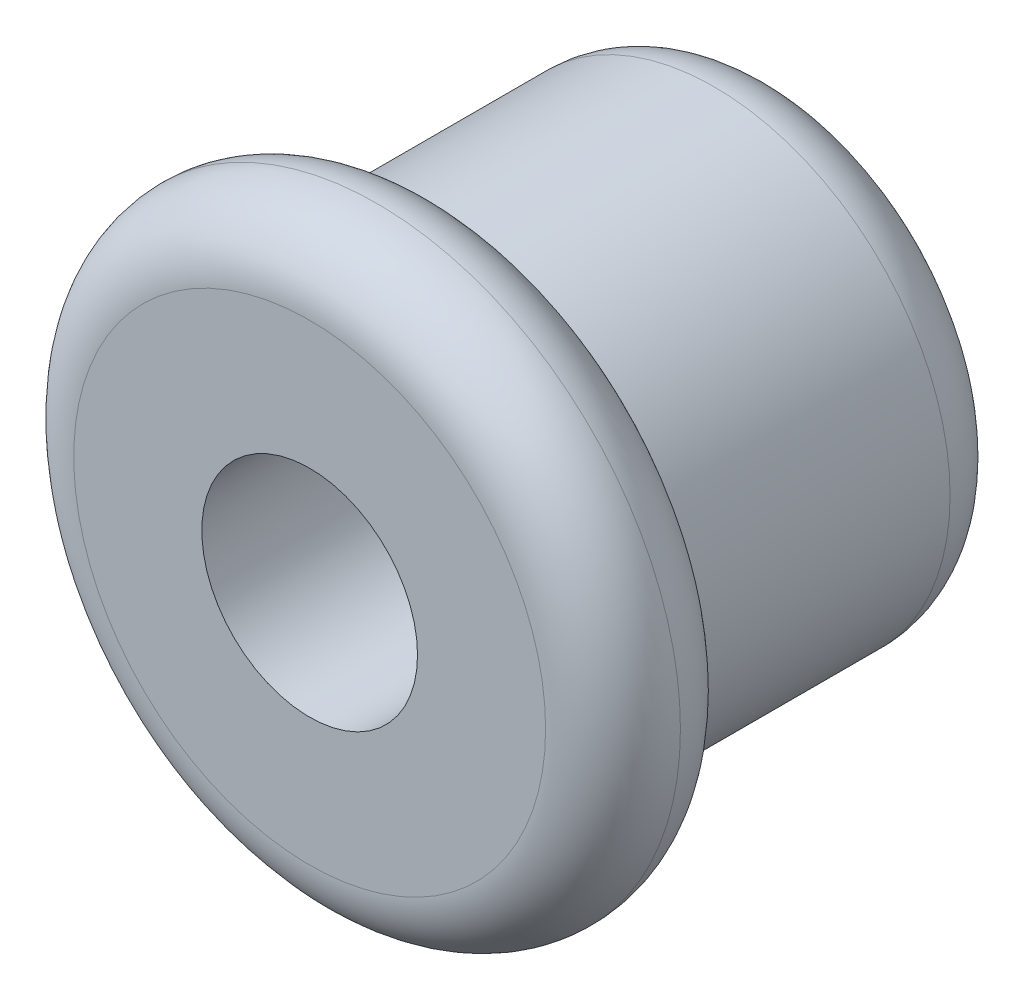
ISO-10303-21;
HEADER;
FILE_DESCRIPTION(('STEP AP214'),'2;1');
FILE_NAME('part.step','',(''),(''),'','','');
FILE_SCHEMA(('AUTOMOTIVE_DESIGN { 1 0 10303 214 1 1 1 1 }'));
ENDSEC;
DATA;
#1=APPLICATION_CONTEXT('core data for automotive mechanical design processes');
#2=APPLICATION_PROTOCOL_DEFINITION('international standard','automotive_design',2000,#1);
#3=PRODUCT_CONTEXT('',#1,'mechanical');
#4=PRODUCT('Part','Part','',(#3));
#5=PRODUCT_RELATED_PRODUCT_CATEGORY('part','',(#4));
#6=PRODUCT_DEFINITION_FORMATION('','',#4);
#7=PRODUCT_DEFINITION_CONTEXT('part definition',#1,'design');
#8=PRODUCT_DEFINITION('design','',#6,#7);
#9=PRODUCT_DEFINITION_SHAPE('','',#8);
#10=(LENGTH_UNIT() NAMED_UNIT(*) SI_UNIT(.MILLI.,.METRE.));
#11=(NAMED_UNIT(*) PLANE_ANGLE_UNIT() SI_UNIT($,.RADIAN.));
#12=(NAMED_UNIT(*) SI_UNIT($,.STERADIAN.) SOLID_ANGLE_UNIT());
#13=UNCERTAINTY_MEASURE_WITH_UNIT(LENGTH_MEASURE(1.E-05),#10,'distance_accuracy_value','');
#14=(GEOMETRIC_REPRESENTATION_CONTEXT(3) GLOBAL_UNCERTAINTY_ASSIGNED_CONTEXT((#13)) GLOBAL_UNIT_ASSIGNED_CONTEXT((#10,
#11,#12)) REPRESENTATION_CONTEXT('',''));
#15=CARTESIAN_POINT('',(0.,0.,0.));
#16=DIRECTION('',(0.,0.,1.));
#17=DIRECTION('',(1.,0.,0.));
#18=AXIS2_PLACEMENT_3D('',#15,#16,#17);
#19=CARTESIAN_POINT('',(0.,0.,2.5));
#20=DIRECTION('',(0.,0.,-1.));
#21=DIRECTION('',(-1.,0.,0.));
#22=AXIS2_PLACEMENT_3D('',#19,#20,#21);
#23=CYLINDRICAL_SURFACE('',#22,1.75);
#24=CARTESIAN_POINT('',(0.,0.,0.5));
#25=DIRECTION('',(0.,0.,1.));
#26=DIRECTION('',(1.,0.,0.));
#27=AXIS2_PLACEMENT_3D('',#24,#25,#26);
#28=CIRCLE('',#27,1.75);
#29=CARTESIAN_POINT('',(1.75,0.,0.5));
#30=VERTEX_POINT('',#29);
#31=EDGE_CURVE('E44',#30,#30,#28,.T.);
#32=ORIENTED_EDGE('',*,*,#31,.T.);
#33=EDGE_LOOP('',(#32));
#34=FACE_BOUND('',#33,.T.);
#35=CARTESIAN_POINT('',(0.,0.,2.5));
#36=DIRECTION('',(0.,0.,1.));
#37=DIRECTION('',(1.,0.,0.));
#38=AXIS2_PLACEMENT_3D('',#35,#36,#37);
#39=CIRCLE('',#38,1.75);
#40=CARTESIAN_POINT('',(1.75,0.,2.5));
#41=VERTEX_POINT('',#40);
#42=EDGE_CURVE('E49',#41,#41,#39,.T.);
#43=ORIENTED_EDGE('',*,*,#42,.F.);
#44=EDGE_LOOP('',(#43));
#45=FACE_BOUND('',#44,.T.);
#46=ADVANCED_FACE('F32',(#34,#45),#23,.T.);
#47=CARTESIAN_POINT('',(0.,0.,0.));
#48=DIRECTION('',(0.,0.,1.));
#49=DIRECTION('',(1.,0.,0.));
#50=AXIS2_PLACEMENT_3D('',#47,#48,#49);
#51=PLANE('',#50);
#52=CARTESIAN_POINT('',(0.,0.,0.));
#53=DIRECTION('',(0.,0.,1.));
#54=DIRECTION('',(1.,0.,0.));
#55=AXIS2_PLACEMENT_3D('',#52,#53,#54);
#56=CIRCLE('',#55,1.25);
#57=CARTESIAN_POINT('',(1.25,0.,0.));
#58=VERTEX_POINT('',#57);
#59=EDGE_CURVE('E40',#58,#58,#56,.F.);
#60=ORIENTED_EDGE('',*,*,#59,.T.);
#61=EDGE_LOOP('',(#60));
#62=FACE_BOUND('',#61,.T.);
#63=CARTESIAN_POINT('',(0.,0.,0.));
#64=DIRECTION('',(0.,0.,1.));
#65=DIRECTION('',(1.,0.,0.));
#66=AXIS2_PLACEMENT_3D('',#63,#64,#65);
#67=CIRCLE('',#66,0.8);
#68=CARTESIAN_POINT('',(0.8,0.,0.));
#69=VERTEX_POINT('',#68);
#70=EDGE_CURVE('E53',#69,#69,#67,.T.);
#71=ORIENTED_EDGE('',*,*,#70,.T.);
#72=EDGE_LOOP('',(#71));
#73=FACE_BOUND('',#72,.T.);
#74=ADVANCED_FACE('F76',(#62,#73),#51,.F.);
#75=CARTESIAN_POINT('',(0.,0.,3.5));
#76=DIRECTION('',(0.,0.,1.));
#77=DIRECTION('',(1.,0.,0.));
#78=AXIS2_PLACEMENT_3D('',#75,#76,#77);
#79=PLANE('',#78);
#80=CARTESIAN_POINT('',(0.,0.,3.5));
#81=DIRECTION('',(0.,0.,1.));
#82=DIRECTION('',(1.,0.,0.));
#83=AXIS2_PLACEMENT_3D('',#80,#81,#82);
#84=CIRCLE('',#83,1.75);
#85=CARTESIAN_POINT('',(1.75,0.,3.5));
#86=VERTEX_POINT('',#85);
#87=EDGE_CURVE('E10',#86,#86,#84,.T.);
#88=ORIENTED_EDGE('',*,*,#87,.T.);
#89=EDGE_LOOP('',(#88));
#90=FACE_BOUND('',#89,.T.);
#91=CARTESIAN_POINT('',(0.,0.,3.5));
#92=DIRECTION('',(0.,0.,1.));
#93=DIRECTION('',(1.,0.,0.));
#94=AXIS2_PLACEMENT_3D('',#91,#92,#93);
#95=CIRCLE('',#94,0.8);
#96=CARTESIAN_POINT('',(0.8,0.,3.5));
#97=VERTEX_POINT('',#96);
#98=EDGE_CURVE('E50',#97,#97,#95,.T.);
#99=ORIENTED_EDGE('',*,*,#98,.F.);
#100=EDGE_LOOP('',(#99));
#101=FACE_BOUND('',#100,.T.);
#102=ADVANCED_FACE('F82',(#90,#101),#79,.T.);
#103=CARTESIAN_POINT('',(0.,0.,0.));
#104=DIRECTION('',(0.,0.,1.));
#105=DIRECTION('',(1.,0.,0.));
#106=AXIS2_PLACEMENT_3D('',#103,#104,#105);
#107=CYLINDRICAL_SURFACE('',#106,0.8);
#108=ORIENTED_EDGE('',*,*,#98,.T.);
#109=EDGE_LOOP('',(#108));
#110=FACE_BOUND('',#109,.T.);
#111=ORIENTED_EDGE('',*,*,#70,.F.);
#112=EDGE_LOOP('',(#111));
#113=FACE_BOUND('',#112,.T.);
#114=ADVANCED_FACE('F72',(#110,#113),#107,.F.);
#115=CARTESIAN_POINT('',(0.,0.,0.5));
#116=DIRECTION('',(0.,0.,1.));
#117=DIRECTION('',(1.,0.,0.));
#118=AXIS2_PLACEMENT_3D('',#115,#116,#117);
#119=TOROIDAL_SURFACE('',#118,1.25,0.5);
#120=ORIENTED_EDGE('',*,*,#59,.F.);
#121=EDGE_LOOP('',(#120));
#122=FACE_BOUND('',#121,.T.);
#123=ORIENTED_EDGE('',*,*,#31,.F.);
#124=EDGE_LOOP('',(#123));
#125=FACE_BOUND('',#124,.T.);
#126=ADVANCED_FACE('F65',(#122,#125),#119,.T.);
#127=CARTESIAN_POINT('',(0.,0.,3.));
#128=DIRECTION('',(0.,0.,1.));
#129=DIRECTION('',(1.,0.,0.));
#130=AXIS2_PLACEMENT_3D('',#127,#128,#129);
#131=TOROIDAL_SURFACE('',#130,1.75,0.5);
#132=ORIENTED_EDGE('',*,*,#87,.F.);
#133=EDGE_LOOP('',(#132));
#134=FACE_BOUND('',#133,.T.);
#135=CARTESIAN_POINT('',(0.,0.,3.));
#136=DIRECTION('',(0.,0.,1.));
#137=DIRECTION('',(1.,0.,0.));
#138=AXIS2_PLACEMENT_3D('',#135,#136,#137);
#139=CIRCLE('',#138,2.25);
#140=CARTESIAN_POINT('',(2.25,0.,3.));
#141=VERTEX_POINT('',#140);
#142=EDGE_CURVE('E36',#141,#141,#139,.F.);
#143=ORIENTED_EDGE('',*,*,#142,.F.);
#144=EDGE_LOOP('',(#143));
#145=FACE_BOUND('',#144,.T.);
#146=ADVANCED_FACE('F34',(#134,#145),#131,.T.);
#147=CARTESIAN_POINT('',(0.,0.,3.));
#148=DIRECTION('',(0.,0.,1.));
#149=DIRECTION('',(1.,0.,0.));
#150=AXIS2_PLACEMENT_3D('',#147,#148,#149);
#151=TOROIDAL_SURFACE('',#150,1.75,0.5);
#152=ORIENTED_EDGE('',*,*,#42,.T.);
#153=EDGE_LOOP('',(#152));
#154=FACE_BOUND('',#153,.T.);
#155=ORIENTED_EDGE('',*,*,#142,.T.);
#156=EDGE_LOOP('',(#155));
#157=FACE_BOUND('',#156,.T.);
#158=ADVANCED_FACE('F62',(#154,#157),#151,.T.);
#159=CLOSED_SHELL('',(#46,#74,#102,#114,#126,#146,#158));
#160=MANIFOLD_SOLID_BREP('B2',#159);
#161=ADVANCED_BREP_SHAPE_REPRESENTATION('',(#18,#160),#14);
#162=SHAPE_DEFINITION_REPRESENTATION(#9,#161);
ENDSEC;
END-ISO-10303-21;
